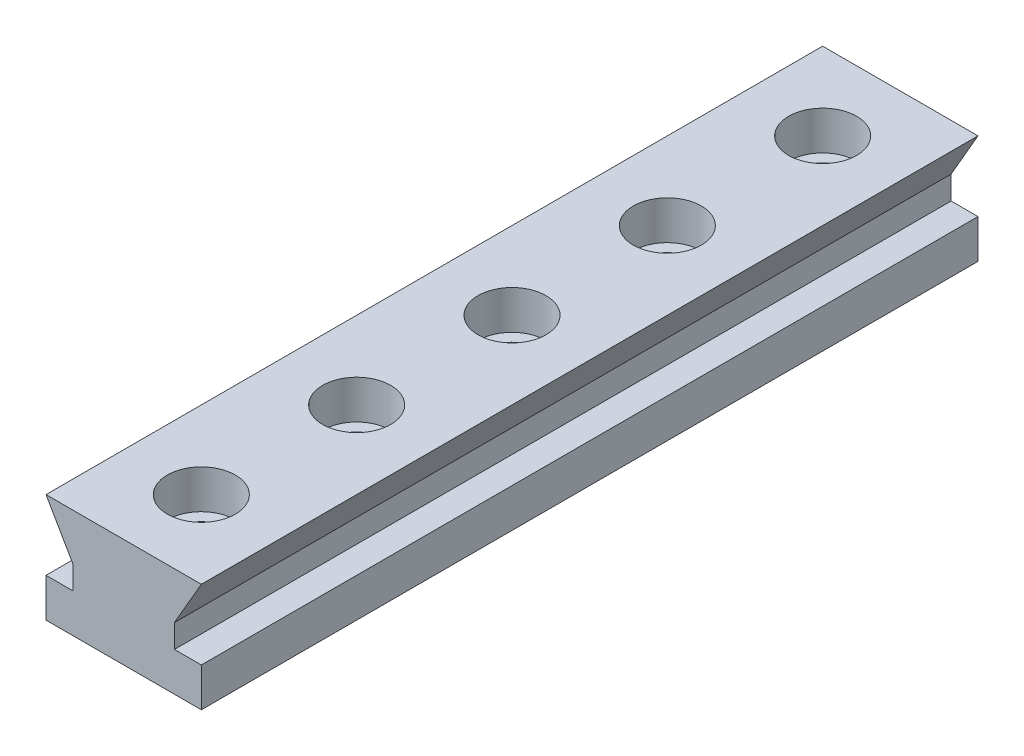
ISO-10303-21;
HEADER;
FILE_DESCRIPTION(('STEP AP214'),'2;1');
FILE_NAME('part.step','',(''),(''),'','','');
FILE_SCHEMA(('AUTOMOTIVE_DESIGN { 1 0 10303 214 1 1 1 1 }'));
ENDSEC;
DATA;
#1=APPLICATION_CONTEXT('core data for automotive mechanical design processes');
#2=APPLICATION_PROTOCOL_DEFINITION('international standard','automotive_design',2000,#1);
#3=PRODUCT_CONTEXT('',#1,'mechanical');
#4=PRODUCT('Part','Part','',(#3));
#5=PRODUCT_RELATED_PRODUCT_CATEGORY('part','',(#4));
#6=PRODUCT_DEFINITION_FORMATION('','',#4);
#7=PRODUCT_DEFINITION_CONTEXT('part definition',#1,'design');
#8=PRODUCT_DEFINITION('design','',#6,#7);
#9=PRODUCT_DEFINITION_SHAPE('','',#8);
#10=(LENGTH_UNIT() NAMED_UNIT(*) SI_UNIT(.MILLI.,.METRE.));
#11=(NAMED_UNIT(*) PLANE_ANGLE_UNIT() SI_UNIT($,.RADIAN.));
#12=(NAMED_UNIT(*) SI_UNIT($,.STERADIAN.) SOLID_ANGLE_UNIT());
#13=UNCERTAINTY_MEASURE_WITH_UNIT(LENGTH_MEASURE(1.E-05),#10,'distance_accuracy_value','');
#14=(GEOMETRIC_REPRESENTATION_CONTEXT(3) GLOBAL_UNCERTAINTY_ASSIGNED_CONTEXT((#13)) GLOBAL_UNIT_ASSIGNED_CONTEXT((#10,
#11,#12)) REPRESENTATION_CONTEXT('',''));
#15=CARTESIAN_POINT('',(0.,0.,0.));
#16=DIRECTION('',(0.,0.,1.));
#17=DIRECTION('',(1.,0.,0.));
#18=AXIS2_PLACEMENT_3D('',#15,#16,#17);
#19=CARTESIAN_POINT('',(0.,0.,127.));
#20=DIRECTION('',(0.,-1.,0.));
#21=DIRECTION('',(0.,0.,-1.));
#22=AXIS2_PLACEMENT_3D('',#19,#20,#21);
#23=PLANE('',#22);
#24=DIRECTION('',(-1.,0.,0.));
#25=VECTOR('',#24,1.);
#26=CARTESIAN_POINT('',(0.,0.,0.));
#27=LINE('',#26,#25);
#28=CARTESIAN_POINT('',(25.4,0.,0.));
#29=VERTEX_POINT('',#28);
#30=CARTESIAN_POINT('',(0.,0.,0.));
#31=VERTEX_POINT('',#30);
#32=EDGE_CURVE('E98',#29,#31,#27,.T.);
#33=ORIENTED_EDGE('',*,*,#32,.T.);
#34=DIRECTION('',(0.,0.,-1.));
#35=VECTOR('',#34,1.);
#36=CARTESIAN_POINT('',(0.,0.,127.));
#37=LINE('',#36,#35);
#38=CARTESIAN_POINT('',(0.,0.,127.));
#39=VERTEX_POINT('',#38);
#40=EDGE_CURVE('E149',#39,#31,#37,.T.);
#41=ORIENTED_EDGE('',*,*,#40,.F.);
#42=DIRECTION('',(-1.,0.,0.));
#43=VECTOR('',#42,1.);
#44=CARTESIAN_POINT('',(0.,0.,127.));
#45=LINE('',#44,#43);
#46=CARTESIAN_POINT('',(25.4,0.,127.));
#47=VERTEX_POINT('',#46);
#48=EDGE_CURVE('E57',#47,#39,#45,.T.);
#49=ORIENTED_EDGE('',*,*,#48,.F.);
#50=DIRECTION('',(0.,0.,-1.));
#51=VECTOR('',#50,1.);
#52=CARTESIAN_POINT('',(25.4,0.,127.));
#53=LINE('',#52,#51);
#54=EDGE_CURVE('E143',#47,#29,#53,.T.);
#55=ORIENTED_EDGE('',*,*,#54,.T.);
#56=EDGE_LOOP('',(#33,#41,#49,#55));
#57=FACE_BOUND('',#56,.T.);
#58=CARTESIAN_POINT('',(12.7,0.,114.3));
#59=DIRECTION('',(0.,1.,0.));
#60=DIRECTION('',(0.,0.,1.));
#61=AXIS2_PLACEMENT_3D('',#58,#59,#60);
#62=CIRCLE('',#61,5.55625);
#63=CARTESIAN_POINT('',(12.7,0.,119.85625));
#64=VERTEX_POINT('',#63);
#65=EDGE_CURVE('E255',#64,#64,#62,.T.);
#66=ORIENTED_EDGE('',*,*,#65,.F.);
#67=EDGE_LOOP('',(#66));
#68=FACE_BOUND('',#67,.T.);
#69=CARTESIAN_POINT('',(12.7,0.,88.9));
#70=DIRECTION('',(0.,1.,0.));
#71=DIRECTION('',(0.,0.,1.));
#72=AXIS2_PLACEMENT_3D('',#69,#70,#71);
#73=CIRCLE('',#72,5.55625);
#74=CARTESIAN_POINT('',(12.7,0.,94.45625));
#75=VERTEX_POINT('',#74);
#76=EDGE_CURVE('E271',#75,#75,#73,.T.);
#77=ORIENTED_EDGE('',*,*,#76,.F.);
#78=EDGE_LOOP('',(#77));
#79=FACE_BOUND('',#78,.T.);
#80=CARTESIAN_POINT('',(12.7,0.,63.5));
#81=DIRECTION('',(0.,1.,0.));
#82=DIRECTION('',(0.,0.,1.));
#83=AXIS2_PLACEMENT_3D('',#80,#81,#82);
#84=CIRCLE('',#83,5.55625);
#85=CARTESIAN_POINT('',(12.7,0.,69.05625));
#86=VERTEX_POINT('',#85);
#87=EDGE_CURVE('E287',#86,#86,#84,.T.);
#88=ORIENTED_EDGE('',*,*,#87,.F.);
#89=EDGE_LOOP('',(#88));
#90=FACE_BOUND('',#89,.T.);
#91=CARTESIAN_POINT('',(12.7,0.,38.1));
#92=DIRECTION('',(0.,1.,0.));
#93=DIRECTION('',(0.,0.,1.));
#94=AXIS2_PLACEMENT_3D('',#91,#92,#93);
#95=CIRCLE('',#94,5.55625);
#96=CARTESIAN_POINT('',(12.7,0.,43.65625));
#97=VERTEX_POINT('',#96);
#98=EDGE_CURVE('E303',#97,#97,#95,.T.);
#99=ORIENTED_EDGE('',*,*,#98,.F.);
#100=EDGE_LOOP('',(#99));
#101=FACE_BOUND('',#100,.T.);
#102=CARTESIAN_POINT('',(12.7,0.,12.7));
#103=DIRECTION('',(0.,1.,0.));
#104=DIRECTION('',(0.,0.,1.));
#105=AXIS2_PLACEMENT_3D('',#102,#103,#104);
#106=CIRCLE('',#105,5.55625);
#107=CARTESIAN_POINT('',(12.7,0.,18.25625));
#108=VERTEX_POINT('',#107);
#109=EDGE_CURVE('E319',#108,#108,#106,.T.);
#110=ORIENTED_EDGE('',*,*,#109,.F.);
#111=EDGE_LOOP('',(#110));
#112=FACE_BOUND('',#111,.T.);
#113=ADVANCED_FACE('F39',(#57,#68,#79,#90,#101,#112),#23,.F.);
#114=CARTESIAN_POINT('',(4.399409051225,-7.62,127.));
#115=DIRECTION('',(0.866025403784436,0.500000000000004,0.));
#116=DIRECTION('',(-0.500000000000004,0.866025403784436,0.));
#117=AXIS2_PLACEMENT_3D('',#114,#115,#116);
#118=PLANE('',#117);
#119=DIRECTION('',(0.500000000000004,-0.866025403784436,0.));
#120=VECTOR('',#119,1.);
#121=CARTESIAN_POINT('',(4.399409051225,-7.62,0.));
#122=LINE('',#121,#120);
#123=CARTESIAN_POINT('',(4.399409051225,-7.62,0.));
#124=VERTEX_POINT('',#123);
#125=EDGE_CURVE('E153',#31,#124,#122,.T.);
#126=ORIENTED_EDGE('',*,*,#125,.T.);
#127=DIRECTION('',(0.,0.,-1.));
#128=VECTOR('',#127,1.);
#129=CARTESIAN_POINT('',(4.399409051225,-7.62,127.));
#130=LINE('',#129,#128);
#131=CARTESIAN_POINT('',(4.399409051225,-7.62,127.));
#132=VERTEX_POINT('',#131);
#133=EDGE_CURVE('E11',#132,#124,#130,.T.);
#134=ORIENTED_EDGE('',*,*,#133,.F.);
#135=DIRECTION('',(0.500000000000004,-0.866025403784436,0.));
#136=VECTOR('',#135,1.);
#137=CARTESIAN_POINT('',(4.399409051225,-7.62,127.));
#138=LINE('',#137,#136);
#139=EDGE_CURVE('E182',#39,#132,#138,.T.);
#140=ORIENTED_EDGE('',*,*,#139,.F.);
#141=ORIENTED_EDGE('',*,*,#40,.T.);
#142=EDGE_LOOP('',(#126,#134,#140,#141));
#143=FACE_BOUND('',#142,.T.);
#144=ADVANCED_FACE('F41',(#143),#118,.F.);
#145=CARTESIAN_POINT('',(4.399409051225,-11.43,127.));
#146=DIRECTION('',(1.,0.,0.));
#147=DIRECTION('',(0.,1.,0.));
#148=AXIS2_PLACEMENT_3D('',#145,#146,#147);
#149=PLANE('',#148);
#150=DIRECTION('',(0.,-1.,0.));
#151=VECTOR('',#150,1.);
#152=CARTESIAN_POINT('',(4.399409051225,-11.43,0.));
#153=LINE('',#152,#151);
#154=CARTESIAN_POINT('',(4.399409051225,-11.43,0.));
#155=VERTEX_POINT('',#154);
#156=EDGE_CURVE('E157',#124,#155,#153,.T.);
#157=ORIENTED_EDGE('',*,*,#156,.T.);
#158=DIRECTION('',(0.,0.,-1.));
#159=VECTOR('',#158,1.);
#160=CARTESIAN_POINT('',(4.399409051225,-11.43,127.));
#161=LINE('',#160,#159);
#162=CARTESIAN_POINT('',(4.399409051225,-11.43,127.));
#163=VERTEX_POINT('',#162);
#164=EDGE_CURVE('E49',#163,#155,#161,.T.);
#165=ORIENTED_EDGE('',*,*,#164,.F.);
#166=DIRECTION('',(0.,-1.,0.));
#167=VECTOR('',#166,1.);
#168=CARTESIAN_POINT('',(4.399409051225,-11.43,127.));
#169=LINE('',#168,#167);
#170=EDGE_CURVE('E106',#132,#163,#169,.T.);
#171=ORIENTED_EDGE('',*,*,#170,.F.);
#172=ORIENTED_EDGE('',*,*,#133,.T.);
#173=EDGE_LOOP('',(#157,#165,#171,#172));
#174=FACE_BOUND('',#173,.T.);
#175=ADVANCED_FACE('F331',(#174),#149,.F.);
#176=CARTESIAN_POINT('',(0.,-11.43,127.));
#177=DIRECTION('',(0.,-1.,0.));
#178=DIRECTION('',(0.,0.,-1.));
#179=AXIS2_PLACEMENT_3D('',#176,#177,#178);
#180=PLANE('',#179);
#181=DIRECTION('',(-1.,0.,0.));
#182=VECTOR('',#181,1.);
#183=CARTESIAN_POINT('',(0.,-11.43,0.));
#184=LINE('',#183,#182);
#185=CARTESIAN_POINT('',(0.,-11.43,0.));
#186=VERTEX_POINT('',#185);
#187=EDGE_CURVE('E161',#155,#186,#184,.T.);
#188=ORIENTED_EDGE('',*,*,#187,.T.);
#189=DIRECTION('',(0.,0.,-1.));
#190=VECTOR('',#189,1.);
#191=CARTESIAN_POINT('',(0.,-11.43,127.));
#192=LINE('',#191,#190);
#193=CARTESIAN_POINT('',(0.,-11.43,127.));
#194=VERTEX_POINT('',#193);
#195=EDGE_CURVE('E201',#194,#186,#192,.T.);
#196=ORIENTED_EDGE('',*,*,#195,.F.);
#197=DIRECTION('',(-1.,0.,0.));
#198=VECTOR('',#197,1.);
#199=CARTESIAN_POINT('',(0.,-11.43,127.));
#200=LINE('',#199,#198);
#201=EDGE_CURVE('E211',#163,#194,#200,.T.);
#202=ORIENTED_EDGE('',*,*,#201,.F.);
#203=ORIENTED_EDGE('',*,*,#164,.T.);
#204=EDGE_LOOP('',(#188,#196,#202,#203));
#205=FACE_BOUND('',#204,.T.);
#206=ADVANCED_FACE('F209',(#205),#180,.F.);
#207=CARTESIAN_POINT('',(0.,-17.78,127.));
#208=DIRECTION('',(1.,0.,0.));
#209=DIRECTION('',(0.,0.,-1.));
#210=AXIS2_PLACEMENT_3D('',#207,#208,#209);
#211=PLANE('',#210);
#212=DIRECTION('',(0.,-1.,0.));
#213=VECTOR('',#212,1.);
#214=CARTESIAN_POINT('',(0.,-17.78,0.));
#215=LINE('',#214,#213);
#216=CARTESIAN_POINT('',(0.,-17.78,0.));
#217=VERTEX_POINT('',#216);
#218=EDGE_CURVE('E164',#186,#217,#215,.T.);
#219=ORIENTED_EDGE('',*,*,#218,.T.);
#220=DIRECTION('',(0.,0.,-1.));
#221=VECTOR('',#220,1.);
#222=CARTESIAN_POINT('',(0.,-17.78,127.));
#223=LINE('',#222,#221);
#224=CARTESIAN_POINT('',(0.,-17.78,127.));
#225=VERTEX_POINT('',#224);
#226=EDGE_CURVE('E197',#225,#217,#223,.T.);
#227=ORIENTED_EDGE('',*,*,#226,.F.);
#228=DIRECTION('',(0.,-1.,0.));
#229=VECTOR('',#228,1.);
#230=CARTESIAN_POINT('',(0.,-17.78,127.));
#231=LINE('',#230,#229);
#232=EDGE_CURVE('E230',#194,#225,#231,.T.);
#233=ORIENTED_EDGE('',*,*,#232,.F.);
#234=ORIENTED_EDGE('',*,*,#195,.T.);
#235=EDGE_LOOP('',(#219,#227,#233,#234));
#236=FACE_BOUND('',#235,.T.);
#237=ADVANCED_FACE('F220',(#236),#211,.F.);
#238=CARTESIAN_POINT('',(25.4,-17.78,127.));
#239=DIRECTION('',(0.,1.,0.));
#240=DIRECTION('',(-1.,0.,0.));
#241=AXIS2_PLACEMENT_3D('',#238,#239,#240);
#242=PLANE('',#241);
#243=CARTESIAN_POINT('',(12.7,-17.78,12.7));
#244=DIRECTION('',(0.,1.,0.));
#245=DIRECTION('',(-1.,0.,0.));
#246=AXIS2_PLACEMENT_3D('',#243,#244,#245);
#247=CIRCLE('',#246,3.57124);
#248=CARTESIAN_POINT('',(9.12876,-17.78,12.7));
#249=VERTEX_POINT('',#248);
#250=EDGE_CURVE('E307',#249,#249,#247,.T.);
#251=ORIENTED_EDGE('',*,*,#250,.T.);
#252=EDGE_LOOP('',(#251));
#253=FACE_BOUND('',#252,.T.);
#254=CARTESIAN_POINT('',(12.7,-17.78,38.1));
#255=DIRECTION('',(0.,1.,0.));
#256=DIRECTION('',(-1.,0.,0.));
#257=AXIS2_PLACEMENT_3D('',#254,#255,#256);
#258=CIRCLE('',#257,3.57124);
#259=CARTESIAN_POINT('',(9.12876,-17.78,38.1));
#260=VERTEX_POINT('',#259);
#261=EDGE_CURVE('E291',#260,#260,#258,.T.);
#262=ORIENTED_EDGE('',*,*,#261,.T.);
#263=EDGE_LOOP('',(#262));
#264=FACE_BOUND('',#263,.T.);
#265=CARTESIAN_POINT('',(12.7,-17.78,63.5));
#266=DIRECTION('',(0.,1.,0.));
#267=DIRECTION('',(-1.,0.,0.));
#268=AXIS2_PLACEMENT_3D('',#265,#266,#267);
#269=CIRCLE('',#268,3.57124);
#270=CARTESIAN_POINT('',(9.12876,-17.78,63.5));
#271=VERTEX_POINT('',#270);
#272=EDGE_CURVE('E275',#271,#271,#269,.T.);
#273=ORIENTED_EDGE('',*,*,#272,.T.);
#274=EDGE_LOOP('',(#273));
#275=FACE_BOUND('',#274,.T.);
#276=CARTESIAN_POINT('',(12.7,-17.78,88.9));
#277=DIRECTION('',(0.,1.,0.));
#278=DIRECTION('',(-1.,0.,0.));
#279=AXIS2_PLACEMENT_3D('',#276,#277,#278);
#280=CIRCLE('',#279,3.57124);
#281=CARTESIAN_POINT('',(9.12876,-17.78,88.9));
#282=VERTEX_POINT('',#281);
#283=EDGE_CURVE('E259',#282,#282,#280,.T.);
#284=ORIENTED_EDGE('',*,*,#283,.T.);
#285=EDGE_LOOP('',(#284));
#286=FACE_BOUND('',#285,.T.);
#287=CARTESIAN_POINT('',(12.7,-17.78,114.3));
#288=DIRECTION('',(0.,1.,0.));
#289=DIRECTION('',(-1.,0.,0.));
#290=AXIS2_PLACEMENT_3D('',#287,#288,#289);
#291=CIRCLE('',#290,3.57124);
#292=CARTESIAN_POINT('',(9.12876000000001,-17.78,114.3));
#293=VERTEX_POINT('',#292);
#294=EDGE_CURVE('E158',#293,#293,#291,.T.);
#295=ORIENTED_EDGE('',*,*,#294,.T.);
#296=EDGE_LOOP('',(#295));
#297=FACE_BOUND('',#296,.T.);
#298=DIRECTION('',(1.,0.,0.));
#299=VECTOR('',#298,1.);
#300=CARTESIAN_POINT('',(25.4,-17.78,0.));
#301=LINE('',#300,#299);
#302=CARTESIAN_POINT('',(25.4,-17.78,0.));
#303=VERTEX_POINT('',#302);
#304=EDGE_CURVE('E167',#217,#303,#301,.T.);
#305=ORIENTED_EDGE('',*,*,#304,.T.);
#306=DIRECTION('',(0.,0.,-1.));
#307=VECTOR('',#306,1.);
#308=CARTESIAN_POINT('',(25.4,-17.78,127.));
#309=LINE('',#308,#307);
#310=CARTESIAN_POINT('',(25.4,-17.78,127.));
#311=VERTEX_POINT('',#310);
#312=EDGE_CURVE('E193',#311,#303,#309,.T.);
#313=ORIENTED_EDGE('',*,*,#312,.F.);
#314=DIRECTION('',(1.,0.,0.));
#315=VECTOR('',#314,1.);
#316=CARTESIAN_POINT('',(25.4,-17.78,127.));
#317=LINE('',#316,#315);
#318=EDGE_CURVE('E226',#225,#311,#317,.T.);
#319=ORIENTED_EDGE('',*,*,#318,.F.);
#320=ORIENTED_EDGE('',*,*,#226,.T.);
#321=EDGE_LOOP('',(#305,#313,#319,#320));
#322=FACE_BOUND('',#321,.T.);
#323=ADVANCED_FACE('F224',(#253,#264,#275,#286,#297,#322),#242,.F.);
#324=CARTESIAN_POINT('',(25.4,-11.43,127.));
#325=DIRECTION('',(-1.,0.,0.));
#326=DIRECTION('',(0.,-1.,0.));
#327=AXIS2_PLACEMENT_3D('',#324,#325,#326);
#328=PLANE('',#327);
#329=DIRECTION('',(0.,1.,0.));
#330=VECTOR('',#329,1.);
#331=CARTESIAN_POINT('',(25.4,-11.43,0.));
#332=LINE('',#331,#330);
#333=CARTESIAN_POINT('',(25.4,-11.43,0.));
#334=VERTEX_POINT('',#333);
#335=EDGE_CURVE('E170',#303,#334,#332,.T.);
#336=ORIENTED_EDGE('',*,*,#335,.T.);
#337=DIRECTION('',(0.,0.,-1.));
#338=VECTOR('',#337,1.);
#339=CARTESIAN_POINT('',(25.4,-11.43,127.));
#340=LINE('',#339,#338);
#341=CARTESIAN_POINT('',(25.4,-11.43,127.));
#342=VERTEX_POINT('',#341);
#343=EDGE_CURVE('E189',#342,#334,#340,.T.);
#344=ORIENTED_EDGE('',*,*,#343,.F.);
#345=DIRECTION('',(0.,1.,0.));
#346=VECTOR('',#345,1.);
#347=CARTESIAN_POINT('',(25.4,-11.43,127.));
#348=LINE('',#347,#346);
#349=EDGE_CURVE('E229',#311,#342,#348,.T.);
#350=ORIENTED_EDGE('',*,*,#349,.F.);
#351=ORIENTED_EDGE('',*,*,#312,.T.);
#352=EDGE_LOOP('',(#336,#344,#350,#351));
#353=FACE_BOUND('',#352,.T.);
#354=ADVANCED_FACE('F344',(#353),#328,.F.);
#355=CARTESIAN_POINT('',(21.000590948775,-11.43,127.));
#356=DIRECTION('',(0.,-1.,0.));
#357=DIRECTION('',(0.,0.,-1.));
#358=AXIS2_PLACEMENT_3D('',#355,#356,#357);
#359=PLANE('',#358);
#360=DIRECTION('',(-1.,0.,0.));
#361=VECTOR('',#360,1.);
#362=CARTESIAN_POINT('',(21.000590948775,-11.43,0.));
#363=LINE('',#362,#361);
#364=CARTESIAN_POINT('',(21.000590948775,-11.43,0.));
#365=VERTEX_POINT('',#364);
#366=EDGE_CURVE('E173',#334,#365,#363,.T.);
#367=ORIENTED_EDGE('',*,*,#366,.T.);
#368=DIRECTION('',(0.,0.,-1.));
#369=VECTOR('',#368,1.);
#370=CARTESIAN_POINT('',(21.000590948775,-11.43,127.));
#371=LINE('',#370,#369);
#372=CARTESIAN_POINT('',(21.000590948775,-11.43,127.));
#373=VERTEX_POINT('',#372);
#374=EDGE_CURVE('E142',#373,#365,#371,.T.);
#375=ORIENTED_EDGE('',*,*,#374,.F.);
#376=DIRECTION('',(-1.,0.,0.));
#377=VECTOR('',#376,1.);
#378=CARTESIAN_POINT('',(21.000590948775,-11.43,127.));
#379=LINE('',#378,#377);
#380=EDGE_CURVE('E131',#342,#373,#379,.T.);
#381=ORIENTED_EDGE('',*,*,#380,.F.);
#382=ORIENTED_EDGE('',*,*,#343,.T.);
#383=EDGE_LOOP('',(#367,#375,#381,#382));
#384=FACE_BOUND('',#383,.T.);
#385=ADVANCED_FACE('F341',(#384),#359,.F.);
#386=CARTESIAN_POINT('',(21.000590948775,-7.62,127.));
#387=DIRECTION('',(-1.,0.,0.));
#388=DIRECTION('',(0.,0.,1.));
#389=AXIS2_PLACEMENT_3D('',#386,#387,#388);
#390=PLANE('',#389);
#391=DIRECTION('',(0.,1.,0.));
#392=VECTOR('',#391,1.);
#393=CARTESIAN_POINT('',(21.000590948775,-7.62,0.));
#394=LINE('',#393,#392);
#395=CARTESIAN_POINT('',(21.000590948775,-7.62,0.));
#396=VERTEX_POINT('',#395);
#397=EDGE_CURVE('E140',#365,#396,#394,.T.);
#398=ORIENTED_EDGE('',*,*,#397,.T.);
#399=DIRECTION('',(0.,0.,-1.));
#400=VECTOR('',#399,1.);
#401=CARTESIAN_POINT('',(21.000590948775,-7.62,127.));
#402=LINE('',#401,#400);
#403=CARTESIAN_POINT('',(21.000590948775,-7.62,127.));
#404=VERTEX_POINT('',#403);
#405=EDGE_CURVE('E137',#404,#396,#402,.T.);
#406=ORIENTED_EDGE('',*,*,#405,.F.);
#407=DIRECTION('',(0.,1.,0.));
#408=VECTOR('',#407,1.);
#409=CARTESIAN_POINT('',(21.000590948775,-7.62,127.));
#410=LINE('',#409,#408);
#411=EDGE_CURVE('E125',#373,#404,#410,.T.);
#412=ORIENTED_EDGE('',*,*,#411,.F.);
#413=ORIENTED_EDGE('',*,*,#374,.T.);
#414=EDGE_LOOP('',(#398,#406,#412,#413));
#415=FACE_BOUND('',#414,.T.);
#416=ADVANCED_FACE('F138',(#415),#390,.F.);
#417=CARTESIAN_POINT('',(25.4,0.,127.));
#418=DIRECTION('',(-0.866025403784436,0.500000000000004,0.));
#419=DIRECTION('',(-0.500000000000004,-0.866025403784436,0.));
#420=AXIS2_PLACEMENT_3D('',#417,#418,#419);
#421=PLANE('',#420);
#422=DIRECTION('',(0.500000000000004,0.866025403784436,0.));
#423=VECTOR('',#422,1.);
#424=CARTESIAN_POINT('',(25.4,0.,0.));
#425=LINE('',#424,#423);
#426=EDGE_CURVE('E92',#396,#29,#425,.T.);
#427=ORIENTED_EDGE('',*,*,#426,.T.);
#428=ORIENTED_EDGE('',*,*,#54,.F.);
#429=DIRECTION('',(0.500000000000004,0.866025403784436,0.));
#430=VECTOR('',#429,1.);
#431=CARTESIAN_POINT('',(25.4,0.,127.));
#432=LINE('',#431,#430);
#433=EDGE_CURVE('E129',#404,#47,#432,.T.);
#434=ORIENTED_EDGE('',*,*,#433,.F.);
#435=ORIENTED_EDGE('',*,*,#405,.T.);
#436=EDGE_LOOP('',(#427,#428,#434,#435));
#437=FACE_BOUND('',#436,.T.);
#438=ADVANCED_FACE('F145',(#437),#421,.F.);
#439=CARTESIAN_POINT('',(0.,0.,127.));
#440=DIRECTION('',(0.,0.,-1.));
#441=DIRECTION('',(-1.,0.,0.));
#442=AXIS2_PLACEMENT_3D('',#439,#440,#441);
#443=PLANE('',#442);
#444=ORIENTED_EDGE('',*,*,#139,.T.);
#445=ORIENTED_EDGE('',*,*,#170,.T.);
#446=ORIENTED_EDGE('',*,*,#201,.T.);
#447=ORIENTED_EDGE('',*,*,#232,.T.);
#448=ORIENTED_EDGE('',*,*,#318,.T.);
#449=ORIENTED_EDGE('',*,*,#349,.T.);
#450=ORIENTED_EDGE('',*,*,#380,.T.);
#451=ORIENTED_EDGE('',*,*,#411,.T.);
#452=ORIENTED_EDGE('',*,*,#433,.T.);
#453=ORIENTED_EDGE('',*,*,#48,.T.);
#454=EDGE_LOOP('',(#444,#445,#446,#447,#448,#449,#450,#451,#452,#453));
#455=FACE_BOUND('',#454,.T.);
#456=ADVANCED_FACE('F127',(#455),#443,.F.);
#457=CARTESIAN_POINT('',(0.,0.,0.));
#458=DIRECTION('',(0.,0.,-1.));
#459=DIRECTION('',(-1.,0.,0.));
#460=AXIS2_PLACEMENT_3D('',#457,#458,#459);
#461=PLANE('',#460);
#462=ORIENTED_EDGE('',*,*,#125,.F.);
#463=ORIENTED_EDGE('',*,*,#32,.F.);
#464=ORIENTED_EDGE('',*,*,#426,.F.);
#465=ORIENTED_EDGE('',*,*,#397,.F.);
#466=ORIENTED_EDGE('',*,*,#366,.F.);
#467=ORIENTED_EDGE('',*,*,#335,.F.);
#468=ORIENTED_EDGE('',*,*,#304,.F.);
#469=ORIENTED_EDGE('',*,*,#218,.F.);
#470=ORIENTED_EDGE('',*,*,#187,.F.);
#471=ORIENTED_EDGE('',*,*,#156,.F.);
#472=EDGE_LOOP('',(#462,#463,#464,#465,#466,#467,#468,#469,#470,#471));
#473=FACE_BOUND('',#472,.T.);
#474=ADVANCED_FACE('F215',(#473),#461,.T.);
#475=CARTESIAN_POINT('',(12.7,0.,114.3));
#476=DIRECTION('',(0.,1.,0.));
#477=DIRECTION('',(0.,0.,1.));
#478=AXIS2_PLACEMENT_3D('',#475,#476,#477);
#479=CYLINDRICAL_SURFACE('',#478,3.57124);
#480=ORIENTED_EDGE('',*,*,#294,.F.);
#481=EDGE_LOOP('',(#480));
#482=FACE_BOUND('',#481,.T.);
#483=CARTESIAN_POINT('',(12.7,-6.35,114.3));
#484=DIRECTION('',(0.,1.,0.));
#485=DIRECTION('',(0.,0.,1.));
#486=AXIS2_PLACEMENT_3D('',#483,#484,#485);
#487=CIRCLE('',#486,3.57124);
#488=CARTESIAN_POINT('',(12.7,-6.35,117.87124));
#489=VERTEX_POINT('',#488);
#490=EDGE_CURVE('E247',#489,#489,#487,.T.);
#491=ORIENTED_EDGE('',*,*,#490,.T.);
#492=EDGE_LOOP('',(#491));
#493=FACE_BOUND('',#492,.T.);
#494=ADVANCED_FACE('F404',(#482,#493),#479,.F.);
#495=CARTESIAN_POINT('',(16.27124,-6.35,114.3));
#496=DIRECTION('',(0.,-1.,0.));
#497=DIRECTION('',(0.,0.,-1.));
#498=AXIS2_PLACEMENT_3D('',#495,#496,#497);
#499=PLANE('',#498);
#500=ORIENTED_EDGE('',*,*,#490,.F.);
#501=EDGE_LOOP('',(#500));
#502=FACE_BOUND('',#501,.T.);
#503=CARTESIAN_POINT('',(12.7,-6.35,114.3));
#504=DIRECTION('',(0.,1.,0.));
#505=DIRECTION('',(0.,0.,1.));
#506=AXIS2_PLACEMENT_3D('',#503,#504,#505);
#507=CIRCLE('',#506,5.55625);
#508=CARTESIAN_POINT('',(12.7,-6.35,119.85625));
#509=VERTEX_POINT('',#508);
#510=EDGE_CURVE('E251',#509,#509,#507,.T.);
#511=ORIENTED_EDGE('',*,*,#510,.T.);
#512=EDGE_LOOP('',(#511));
#513=FACE_BOUND('',#512,.T.);
#514=ADVANCED_FACE('F409',(#502,#513),#499,.F.);
#515=CARTESIAN_POINT('',(12.7,0.,114.3));
#516=DIRECTION('',(0.,1.,0.));
#517=DIRECTION('',(0.,0.,1.));
#518=AXIS2_PLACEMENT_3D('',#515,#516,#517);
#519=CYLINDRICAL_SURFACE('',#518,5.55625);
#520=ORIENTED_EDGE('',*,*,#510,.F.);
#521=EDGE_LOOP('',(#520));
#522=FACE_BOUND('',#521,.T.);
#523=ORIENTED_EDGE('',*,*,#65,.T.);
#524=EDGE_LOOP('',(#523));
#525=FACE_BOUND('',#524,.T.);
#526=ADVANCED_FACE('F417',(#522,#525),#519,.F.);
#527=CARTESIAN_POINT('',(12.7,0.,88.9));
#528=DIRECTION('',(0.,1.,0.));
#529=DIRECTION('',(0.,0.,1.));
#530=AXIS2_PLACEMENT_3D('',#527,#528,#529);
#531=CYLINDRICAL_SURFACE('',#530,3.57124);
#532=ORIENTED_EDGE('',*,*,#283,.F.);
#533=EDGE_LOOP('',(#532));
#534=FACE_BOUND('',#533,.T.);
#535=CARTESIAN_POINT('',(12.7,-6.35,88.9));
#536=DIRECTION('',(0.,1.,0.));
#537=DIRECTION('',(0.,0.,1.));
#538=AXIS2_PLACEMENT_3D('',#535,#536,#537);
#539=CIRCLE('',#538,3.57124);
#540=CARTESIAN_POINT('',(12.7,-6.35,92.47124));
#541=VERTEX_POINT('',#540);
#542=EDGE_CURVE('E263',#541,#541,#539,.T.);
#543=ORIENTED_EDGE('',*,*,#542,.T.);
#544=EDGE_LOOP('',(#543));
#545=FACE_BOUND('',#544,.T.);
#546=ADVANCED_FACE('F425',(#534,#545),#531,.F.);
#547=CARTESIAN_POINT('',(16.27124,-6.35,88.9));
#548=DIRECTION('',(0.,-1.,0.));
#549=DIRECTION('',(0.,0.,-1.));
#550=AXIS2_PLACEMENT_3D('',#547,#548,#549);
#551=PLANE('',#550);
#552=ORIENTED_EDGE('',*,*,#542,.F.);
#553=EDGE_LOOP('',(#552));
#554=FACE_BOUND('',#553,.T.);
#555=CARTESIAN_POINT('',(12.7,-6.35,88.9));
#556=DIRECTION('',(0.,1.,0.));
#557=DIRECTION('',(0.,0.,1.));
#558=AXIS2_PLACEMENT_3D('',#555,#556,#557);
#559=CIRCLE('',#558,5.55625);
#560=CARTESIAN_POINT('',(12.7,-6.35,94.45625));
#561=VERTEX_POINT('',#560);
#562=EDGE_CURVE('E267',#561,#561,#559,.T.);
#563=ORIENTED_EDGE('',*,*,#562,.T.);
#564=EDGE_LOOP('',(#563));
#565=FACE_BOUND('',#564,.T.);
#566=ADVANCED_FACE('F433',(#554,#565),#551,.F.);
#567=CARTESIAN_POINT('',(12.7,0.,88.9));
#568=DIRECTION('',(0.,1.,0.));
#569=DIRECTION('',(0.,0.,1.));
#570=AXIS2_PLACEMENT_3D('',#567,#568,#569);
#571=CYLINDRICAL_SURFACE('',#570,5.55625);
#572=ORIENTED_EDGE('',*,*,#562,.F.);
#573=EDGE_LOOP('',(#572));
#574=FACE_BOUND('',#573,.T.);
#575=ORIENTED_EDGE('',*,*,#76,.T.);
#576=EDGE_LOOP('',(#575));
#577=FACE_BOUND('',#576,.T.);
#578=ADVANCED_FACE('F441',(#574,#577),#571,.F.);
#579=CARTESIAN_POINT('',(12.7,0.,63.5));
#580=DIRECTION('',(0.,1.,0.));
#581=DIRECTION('',(0.,0.,1.));
#582=AXIS2_PLACEMENT_3D('',#579,#580,#581);
#583=CYLINDRICAL_SURFACE('',#582,3.57124);
#584=ORIENTED_EDGE('',*,*,#272,.F.);
#585=EDGE_LOOP('',(#584));
#586=FACE_BOUND('',#585,.T.);
#587=CARTESIAN_POINT('',(12.7,-6.35,63.5));
#588=DIRECTION('',(0.,1.,0.));
#589=DIRECTION('',(0.,0.,1.));
#590=AXIS2_PLACEMENT_3D('',#587,#588,#589);
#591=CIRCLE('',#590,3.57124);
#592=CARTESIAN_POINT('',(12.7,-6.35,67.07124));
#593=VERTEX_POINT('',#592);
#594=EDGE_CURVE('E279',#593,#593,#591,.T.);
#595=ORIENTED_EDGE('',*,*,#594,.T.);
#596=EDGE_LOOP('',(#595));
#597=FACE_BOUND('',#596,.T.);
#598=ADVANCED_FACE('F449',(#586,#597),#583,.F.);
#599=CARTESIAN_POINT('',(16.27124,-6.35,63.5));
#600=DIRECTION('',(0.,-1.,0.));
#601=DIRECTION('',(0.,0.,-1.));
#602=AXIS2_PLACEMENT_3D('',#599,#600,#601);
#603=PLANE('',#602);
#604=ORIENTED_EDGE('',*,*,#594,.F.);
#605=EDGE_LOOP('',(#604));
#606=FACE_BOUND('',#605,.T.);
#607=CARTESIAN_POINT('',(12.7,-6.35,63.5));
#608=DIRECTION('',(0.,1.,0.));
#609=DIRECTION('',(0.,0.,1.));
#610=AXIS2_PLACEMENT_3D('',#607,#608,#609);
#611=CIRCLE('',#610,5.55625);
#612=CARTESIAN_POINT('',(12.7,-6.35,69.05625));
#613=VERTEX_POINT('',#612);
#614=EDGE_CURVE('E283',#613,#613,#611,.T.);
#615=ORIENTED_EDGE('',*,*,#614,.T.);
#616=EDGE_LOOP('',(#615));
#617=FACE_BOUND('',#616,.T.);
#618=ADVANCED_FACE('F457',(#606,#617),#603,.F.);
#619=CARTESIAN_POINT('',(12.7,0.,63.5));
#620=DIRECTION('',(0.,1.,0.));
#621=DIRECTION('',(0.,0.,1.));
#622=AXIS2_PLACEMENT_3D('',#619,#620,#621);
#623=CYLINDRICAL_SURFACE('',#622,5.55625);
#624=ORIENTED_EDGE('',*,*,#614,.F.);
#625=EDGE_LOOP('',(#624));
#626=FACE_BOUND('',#625,.T.);
#627=ORIENTED_EDGE('',*,*,#87,.T.);
#628=EDGE_LOOP('',(#627));
#629=FACE_BOUND('',#628,.T.);
#630=ADVANCED_FACE('F465',(#626,#629),#623,.F.);
#631=CARTESIAN_POINT('',(12.7,0.,38.1));
#632=DIRECTION('',(0.,1.,0.));
#633=DIRECTION('',(0.,0.,1.));
#634=AXIS2_PLACEMENT_3D('',#631,#632,#633);
#635=CYLINDRICAL_SURFACE('',#634,3.57124);
#636=ORIENTED_EDGE('',*,*,#261,.F.);
#637=EDGE_LOOP('',(#636));
#638=FACE_BOUND('',#637,.T.);
#639=CARTESIAN_POINT('',(12.7,-6.35,38.1));
#640=DIRECTION('',(0.,1.,0.));
#641=DIRECTION('',(0.,0.,1.));
#642=AXIS2_PLACEMENT_3D('',#639,#640,#641);
#643=CIRCLE('',#642,3.57124);
#644=CARTESIAN_POINT('',(12.7,-6.35,41.67124));
#645=VERTEX_POINT('',#644);
#646=EDGE_CURVE('E295',#645,#645,#643,.T.);
#647=ORIENTED_EDGE('',*,*,#646,.T.);
#648=EDGE_LOOP('',(#647));
#649=FACE_BOUND('',#648,.T.);
#650=ADVANCED_FACE('F473',(#638,#649),#635,.F.);
#651=CARTESIAN_POINT('',(16.27124,-6.35,38.1));
#652=DIRECTION('',(0.,-1.,0.));
#653=DIRECTION('',(0.,0.,-1.));
#654=AXIS2_PLACEMENT_3D('',#651,#652,#653);
#655=PLANE('',#654);
#656=ORIENTED_EDGE('',*,*,#646,.F.);
#657=EDGE_LOOP('',(#656));
#658=FACE_BOUND('',#657,.T.);
#659=CARTESIAN_POINT('',(12.7,-6.35,38.1));
#660=DIRECTION('',(0.,1.,0.));
#661=DIRECTION('',(0.,0.,1.));
#662=AXIS2_PLACEMENT_3D('',#659,#660,#661);
#663=CIRCLE('',#662,5.55625);
#664=CARTESIAN_POINT('',(12.7,-6.35,43.65625));
#665=VERTEX_POINT('',#664);
#666=EDGE_CURVE('E299',#665,#665,#663,.T.);
#667=ORIENTED_EDGE('',*,*,#666,.T.);
#668=EDGE_LOOP('',(#667));
#669=FACE_BOUND('',#668,.T.);
#670=ADVANCED_FACE('F481',(#658,#669),#655,.F.);
#671=CARTESIAN_POINT('',(12.7,0.,38.1));
#672=DIRECTION('',(0.,1.,0.));
#673=DIRECTION('',(0.,0.,1.));
#674=AXIS2_PLACEMENT_3D('',#671,#672,#673);
#675=CYLINDRICAL_SURFACE('',#674,5.55625);
#676=ORIENTED_EDGE('',*,*,#666,.F.);
#677=EDGE_LOOP('',(#676));
#678=FACE_BOUND('',#677,.T.);
#679=ORIENTED_EDGE('',*,*,#98,.T.);
#680=EDGE_LOOP('',(#679));
#681=FACE_BOUND('',#680,.T.);
#682=ADVANCED_FACE('F489',(#678,#681),#675,.F.);
#683=CARTESIAN_POINT('',(12.7,0.,12.7));
#684=DIRECTION('',(0.,1.,0.));
#685=DIRECTION('',(0.,0.,1.));
#686=AXIS2_PLACEMENT_3D('',#683,#684,#685);
#687=CYLINDRICAL_SURFACE('',#686,3.57124);
#688=ORIENTED_EDGE('',*,*,#250,.F.);
#689=EDGE_LOOP('',(#688));
#690=FACE_BOUND('',#689,.T.);
#691=CARTESIAN_POINT('',(12.7,-6.35,12.7));
#692=DIRECTION('',(0.,1.,0.));
#693=DIRECTION('',(0.,0.,1.));
#694=AXIS2_PLACEMENT_3D('',#691,#692,#693);
#695=CIRCLE('',#694,3.57124);
#696=CARTESIAN_POINT('',(12.7,-6.35,16.27124));
#697=VERTEX_POINT('',#696);
#698=EDGE_CURVE('E311',#697,#697,#695,.T.);
#699=ORIENTED_EDGE('',*,*,#698,.T.);
#700=EDGE_LOOP('',(#699));
#701=FACE_BOUND('',#700,.T.);
#702=ADVANCED_FACE('F497',(#690,#701),#687,.F.);
#703=CARTESIAN_POINT('',(16.27124,-6.35,12.7));
#704=DIRECTION('',(0.,-1.,0.));
#705=DIRECTION('',(0.,0.,-1.));
#706=AXIS2_PLACEMENT_3D('',#703,#704,#705);
#707=PLANE('',#706);
#708=ORIENTED_EDGE('',*,*,#698,.F.);
#709=EDGE_LOOP('',(#708));
#710=FACE_BOUND('',#709,.T.);
#711=CARTESIAN_POINT('',(12.7,-6.35,12.7));
#712=DIRECTION('',(0.,1.,0.));
#713=DIRECTION('',(0.,0.,1.));
#714=AXIS2_PLACEMENT_3D('',#711,#712,#713);
#715=CIRCLE('',#714,5.55625);
#716=CARTESIAN_POINT('',(12.7,-6.35,18.25625));
#717=VERTEX_POINT('',#716);
#718=EDGE_CURVE('E315',#717,#717,#715,.T.);
#719=ORIENTED_EDGE('',*,*,#718,.T.);
#720=EDGE_LOOP('',(#719));
#721=FACE_BOUND('',#720,.T.);
#722=ADVANCED_FACE('F505',(#710,#721),#707,.F.);
#723=CARTESIAN_POINT('',(12.7,0.,12.7));
#724=DIRECTION('',(0.,1.,0.));
#725=DIRECTION('',(0.,0.,1.));
#726=AXIS2_PLACEMENT_3D('',#723,#724,#725);
#727=CYLINDRICAL_SURFACE('',#726,5.55625);
#728=ORIENTED_EDGE('',*,*,#718,.F.);
#729=EDGE_LOOP('',(#728));
#730=FACE_BOUND('',#729,.T.);
#731=ORIENTED_EDGE('',*,*,#109,.T.);
#732=EDGE_LOOP('',(#731));
#733=FACE_BOUND('',#732,.T.);
#734=ADVANCED_FACE('F324',(#730,#733),#727,.F.);
#735=CLOSED_SHELL('',(#113,#144,#175,#206,#237,#323,#354,#385,#416,#438,#456,#474,#494,#514,
#526,#546,#566,#578,#598,#618,#630,#650,#670,#682,#702,#722,#734));
#736=MANIFOLD_SOLID_BREP('B2',#735);
#737=ADVANCED_BREP_SHAPE_REPRESENTATION('',(#18,#736),#14);
#738=SHAPE_DEFINITION_REPRESENTATION(#9,#737);
ENDSEC;
END-ISO-10303-21;
